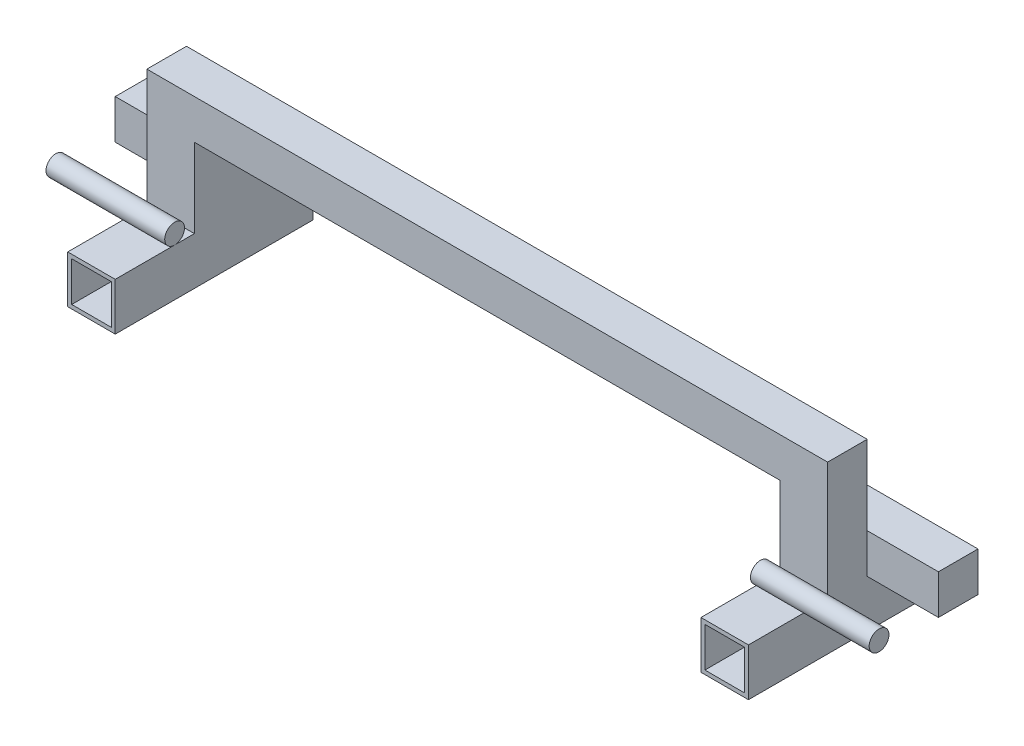
ISO-10303-21;
HEADER;
FILE_DESCRIPTION(('STEP AP214'),'2;1');
FILE_NAME('part.step','',(''),(''),'','','');
FILE_SCHEMA(('AUTOMOTIVE_DESIGN { 1 0 10303 214 1 1 1 1 }'));
ENDSEC;
DATA;
#1=APPLICATION_CONTEXT('core data for automotive mechanical design processes');
#2=APPLICATION_PROTOCOL_DEFINITION('international standard','automotive_design',2000,#1);
#3=PRODUCT_CONTEXT('',#1,'mechanical');
#4=PRODUCT('Part','Part','',(#3));
#5=PRODUCT_RELATED_PRODUCT_CATEGORY('part','',(#4));
#6=PRODUCT_DEFINITION_FORMATION('','',#4);
#7=PRODUCT_DEFINITION_CONTEXT('part definition',#1,'design');
#8=PRODUCT_DEFINITION('design','',#6,#7);
#9=PRODUCT_DEFINITION_SHAPE('','',#8);
#10=(LENGTH_UNIT() NAMED_UNIT(*) SI_UNIT(.MILLI.,.METRE.));
#11=(NAMED_UNIT(*) PLANE_ANGLE_UNIT() SI_UNIT($,.RADIAN.));
#12=(NAMED_UNIT(*) SI_UNIT($,.STERADIAN.) SOLID_ANGLE_UNIT());
#13=UNCERTAINTY_MEASURE_WITH_UNIT(LENGTH_MEASURE(1.E-05),#10,'distance_accuracy_value','');
#14=(GEOMETRIC_REPRESENTATION_CONTEXT(3) GLOBAL_UNCERTAINTY_ASSIGNED_CONTEXT((#13)) GLOBAL_UNIT_ASSIGNED_CONTEXT((#10,
#11,#12)) REPRESENTATION_CONTEXT('',''));
#15=CARTESIAN_POINT('',(0.,0.,0.));
#16=DIRECTION('',(0.,0.,1.));
#17=DIRECTION('',(1.,0.,0.));
#18=AXIS2_PLACEMENT_3D('',#15,#16,#17);
#19=CARTESIAN_POINT('',(75.2455323758821,26.8795883372539,35.));
#20=DIRECTION('',(-1.,0.,0.));
#21=DIRECTION('',(0.,0.,-1.));
#22=AXIS2_PLACEMENT_3D('',#19,#20,#21);
#23=CYLINDRICAL_SURFACE('',#22,2.5);
#24=CARTESIAN_POINT('',(75.2455323758821,26.8795883372539,35.));
#25=DIRECTION('',(1.,0.,0.));
#26=DIRECTION('',(0.,0.,-1.));
#27=AXIS2_PLACEMENT_3D('',#24,#25,#26);
#28=CIRCLE('',#27,2.5);
#29=CARTESIAN_POINT('',(75.2455323758821,26.8795883372539,32.5));
#30=VERTEX_POINT('',#29);
#31=EDGE_CURVE('E45',#30,#30,#28,.T.);
#32=ORIENTED_EDGE('',*,*,#31,.F.);
#33=EDGE_LOOP('',(#32));
#34=FACE_BOUND('',#33,.T.);
#35=CARTESIAN_POINT('',(45.2455323758821,26.8795883372539,35.));
#36=DIRECTION('',(1.,0.,0.));
#37=DIRECTION('',(0.,0.,-1.));
#38=AXIS2_PLACEMENT_3D('',#35,#36,#37);
#39=CIRCLE('',#38,2.5);
#40=CARTESIAN_POINT('',(45.2455323758821,26.8795883372539,32.5));
#41=VERTEX_POINT('',#40);
#42=EDGE_CURVE('E11',#41,#41,#39,.T.);
#43=ORIENTED_EDGE('',*,*,#42,.T.);
#44=EDGE_LOOP('',(#43));
#45=FACE_BOUND('',#44,.T.);
#46=ADVANCED_FACE('F41',(#34,#45),#23,.T.);
#47=CARTESIAN_POINT('',(75.2455323758821,26.8795883372539,35.));
#48=DIRECTION('',(-1.,0.,0.));
#49=DIRECTION('',(0.,0.,-1.));
#50=AXIS2_PLACEMENT_3D('',#47,#48,#49);
#51=PLANE('',#50);
#52=ORIENTED_EDGE('',*,*,#31,.T.);
#53=EDGE_LOOP('',(#52));
#54=FACE_BOUND('',#53,.T.);
#55=ADVANCED_FACE('F43',(#54),#51,.F.);
#56=CARTESIAN_POINT('',(45.2455323758821,26.8795883372539,35.));
#57=DIRECTION('',(-1.,0.,0.));
#58=DIRECTION('',(0.,0.,-1.));
#59=AXIS2_PLACEMENT_3D('',#56,#57,#58);
#60=PLANE('',#59);
#61=ORIENTED_EDGE('',*,*,#42,.F.);
#62=EDGE_LOOP('',(#61));
#63=FACE_BOUND('',#62,.T.);
#64=ADVANCED_FACE('F60',(#63),#60,.T.);
#65=CLOSED_SHELL('',(#46,#55,#64));
#66=MANIFOLD_SOLID_BREP('B2',#65);
#67=CARTESIAN_POINT('',(-132.754467624118,26.8795883372539,35.));
#68=DIRECTION('',(1.,0.,0.));
#69=DIRECTION('',(0.,0.,-1.));
#70=AXIS2_PLACEMENT_3D('',#67,#68,#69);
#71=CYLINDRICAL_SURFACE('',#70,2.5);
#72=CARTESIAN_POINT('',(-132.754467624118,26.8795883372539,35.));
#73=DIRECTION('',(1.,0.,0.));
#74=DIRECTION('',(0.,0.,-1.));
#75=AXIS2_PLACEMENT_3D('',#72,#73,#74);
#76=CIRCLE('',#75,2.5);
#77=CARTESIAN_POINT('',(-132.754467624118,26.8795883372539,32.5));
#78=VERTEX_POINT('',#77);
#79=EDGE_CURVE('E94',#78,#78,#76,.T.);
#80=ORIENTED_EDGE('',*,*,#79,.T.);
#81=EDGE_LOOP('',(#80));
#82=FACE_BOUND('',#81,.T.);
#83=CARTESIAN_POINT('',(-102.754467624118,26.8795883372539,35.));
#84=DIRECTION('',(1.,0.,0.));
#85=DIRECTION('',(0.,0.,-1.));
#86=AXIS2_PLACEMENT_3D('',#83,#84,#85);
#87=CIRCLE('',#86,2.5);
#88=CARTESIAN_POINT('',(-102.754467624118,26.8795883372539,32.5));
#89=VERTEX_POINT('',#88);
#90=EDGE_CURVE('E40',#89,#89,#87,.T.);
#91=ORIENTED_EDGE('',*,*,#90,.F.);
#92=EDGE_LOOP('',(#91));
#93=FACE_BOUND('',#92,.T.);
#94=ADVANCED_FACE('F90',(#82,#93),#71,.T.);
#95=CARTESIAN_POINT('',(-132.754467624118,26.8795883372539,35.));
#96=DIRECTION('',(1.,0.,0.));
#97=DIRECTION('',(0.,0.,-1.));
#98=AXIS2_PLACEMENT_3D('',#95,#96,#97);
#99=PLANE('',#98);
#100=ORIENTED_EDGE('',*,*,#79,.F.);
#101=EDGE_LOOP('',(#100));
#102=FACE_BOUND('',#101,.T.);
#103=ADVANCED_FACE('F92',(#102),#99,.F.);
#104=CARTESIAN_POINT('',(-102.754467624118,26.8795883372539,35.));
#105=DIRECTION('',(1.,0.,0.));
#106=DIRECTION('',(0.,0.,-1.));
#107=AXIS2_PLACEMENT_3D('',#104,#105,#106);
#108=PLANE('',#107);
#109=ORIENTED_EDGE('',*,*,#90,.T.);
#110=EDGE_LOOP('',(#109));
#111=FACE_BOUND('',#110,.T.);
#112=ADVANCED_FACE('F106',(#111),#108,.T.);
#113=CLOSED_SHELL('',(#94,#103,#112));
#114=MANIFOLD_SOLID_BREP('B6',#113);
#115=CARTESIAN_POINT('',(57.2455323758821,44.3795883372539,20.));
#116=DIRECTION('',(0.,-1.,0.));
#117=DIRECTION('',(0.,0.,-1.));
#118=AXIS2_PLACEMENT_3D('',#115,#116,#117);
#119=PLANE('',#118);
#120=DIRECTION('',(-1.,0.,0.));
#121=VECTOR('',#120,1.);
#122=CARTESIAN_POINT('',(57.2455323758821,44.3795883372539,20.));
#123=LINE('',#122,#121);
#124=CARTESIAN_POINT('',(45.2455323758821,44.3795883372539,20.));
#125=VERTEX_POINT('',#124);
#126=CARTESIAN_POINT('',(-102.754467624118,44.3795883372539,20.));
#127=VERTEX_POINT('',#126);
#128=EDGE_CURVE('E153',#125,#127,#123,.T.);
#129=ORIENTED_EDGE('',*,*,#128,.F.);
#130=DIRECTION('',(0.,0.,1.));
#131=VECTOR('',#130,1.);
#132=CARTESIAN_POINT('',(45.2455323758821,44.3795883372539,20.));
#133=LINE('',#132,#131);
#134=CARTESIAN_POINT('',(45.2455323758821,44.3795883372539,30.));
#135=VERTEX_POINT('',#134);
#136=EDGE_CURVE('E148',#125,#135,#133,.T.);
#137=ORIENTED_EDGE('',*,*,#136,.T.);
#138=DIRECTION('',(-1.,0.,0.));
#139=VECTOR('',#138,1.);
#140=CARTESIAN_POINT('',(57.2455323758821,44.3795883372539,30.));
#141=LINE('',#140,#139);
#142=CARTESIAN_POINT('',(-102.754467624118,44.3795883372539,30.));
#143=VERTEX_POINT('',#142);
#144=EDGE_CURVE('E134',#135,#143,#141,.T.);
#145=ORIENTED_EDGE('',*,*,#144,.T.);
#146=DIRECTION('',(0.,0.,1.));
#147=VECTOR('',#146,1.);
#148=CARTESIAN_POINT('',(-102.754467624118,44.3795883372539,20.));
#149=LINE('',#148,#147);
#150=EDGE_CURVE('E436',#127,#143,#149,.T.);
#151=ORIENTED_EDGE('',*,*,#150,.F.);
#152=EDGE_LOOP('',(#129,#137,#145,#151));
#153=FACE_BOUND('',#152,.T.);
#154=ADVANCED_FACE('F130',(#153),#119,.T.);
#155=CARTESIAN_POINT('',(-114.754467624118,24.3795883372539,50.));
#156=DIRECTION('',(0.,-1.,0.));
#157=DIRECTION('',(0.,0.,-1.));
#158=AXIS2_PLACEMENT_3D('',#155,#156,#157);
#159=PLANE('',#158);
#160=DIRECTION('',(1.,0.,0.));
#161=VECTOR('',#160,1.);
#162=CARTESIAN_POINT('',(-114.754467624118,24.3795883372539,30.));
#163=LINE('',#162,#161);
#164=CARTESIAN_POINT('',(-114.754467624118,24.3795883372539,30.));
#165=VERTEX_POINT('',#164);
#166=CARTESIAN_POINT('',(-102.754467624118,24.3795883372539,30.));
#167=VERTEX_POINT('',#166);
#168=EDGE_CURVE('E441',#165,#167,#163,.T.);
#169=ORIENTED_EDGE('',*,*,#168,.F.);
#170=DIRECTION('',(0.,0.,-1.));
#171=VECTOR('',#170,1.);
#172=CARTESIAN_POINT('',(-114.754467624118,24.3795883372539,50.));
#173=LINE('',#172,#171);
#174=CARTESIAN_POINT('',(-114.754467624118,24.3795883372539,50.));
#175=VERTEX_POINT('',#174);
#176=EDGE_CURVE('E509',#175,#165,#173,.T.);
#177=ORIENTED_EDGE('',*,*,#176,.F.);
#178=DIRECTION('',(-1.,0.,0.));
#179=VECTOR('',#178,1.);
#180=CARTESIAN_POINT('',(-114.754467624118,24.3795883372539,50.));
#181=LINE('',#180,#179);
#182=CARTESIAN_POINT('',(-102.754467624118,24.3795883372539,50.));
#183=VERTEX_POINT('',#182);
#184=EDGE_CURVE('E505',#183,#175,#181,.T.);
#185=ORIENTED_EDGE('',*,*,#184,.F.);
#186=DIRECTION('',(0.,0.,-1.));
#187=VECTOR('',#186,1.);
#188=CARTESIAN_POINT('',(-102.754467624118,24.3795883372539,50.));
#189=LINE('',#188,#187);
#190=EDGE_CURVE('E497',#183,#167,#189,.T.);
#191=ORIENTED_EDGE('',*,*,#190,.T.);
#192=EDGE_LOOP('',(#169,#177,#185,#191));
#193=FACE_BOUND('',#192,.T.);
#194=ADVANCED_FACE('F504',(#193),#159,.F.);
#195=CARTESIAN_POINT('',(-132.754467624118,0.,20.));
#196=DIRECTION('',(0.,0.,-1.));
#197=DIRECTION('',(-1.,0.,0.));
#198=AXIS2_PLACEMENT_3D('',#195,#196,#197);
#199=PLANE('',#198);
#200=DIRECTION('',(0.,-1.,0.));
#201=VECTOR('',#200,1.);
#202=CARTESIAN_POINT('',(-114.754467624118,44.3795883372539,20.));
#203=LINE('',#202,#201);
#204=CARTESIAN_POINT('',(-114.754467624118,34.3795883372539,20.));
#205=VERTEX_POINT('',#204);
#206=CARTESIAN_POINT('',(-114.754467624118,24.3795883372539,20.));
#207=VERTEX_POINT('',#206);
#208=EDGE_CURVE('E440',#205,#207,#203,.T.);
#209=ORIENTED_EDGE('',*,*,#208,.F.);
#210=DIRECTION('',(1.,0.,0.));
#211=VECTOR('',#210,1.);
#212=CARTESIAN_POINT('',(-132.754467624118,34.3795883372539,20.));
#213=LINE('',#212,#211);
#214=CARTESIAN_POINT('',(-132.754467624118,34.3795883372539,20.));
#215=VERTEX_POINT('',#214);
#216=EDGE_CURVE('E472',#215,#205,#213,.T.);
#217=ORIENTED_EDGE('',*,*,#216,.F.);
#218=DIRECTION('',(0.,1.,0.));
#219=VECTOR('',#218,1.);
#220=CARTESIAN_POINT('',(-132.754467624118,0.,20.));
#221=LINE('',#220,#219);
#222=CARTESIAN_POINT('',(-132.754467624118,24.3795883372539,20.));
#223=VERTEX_POINT('',#222);
#224=EDGE_CURVE('E463',#223,#215,#221,.T.);
#225=ORIENTED_EDGE('',*,*,#224,.F.);
#226=DIRECTION('',(1.,0.,0.));
#227=VECTOR('',#226,1.);
#228=CARTESIAN_POINT('',(-132.754467624118,24.3795883372539,20.));
#229=LINE('',#228,#227);
#230=EDGE_CURVE('E468',#223,#207,#229,.T.);
#231=ORIENTED_EDGE('',*,*,#230,.T.);
#232=EDGE_LOOP('',(#209,#217,#225,#231));
#233=FACE_BOUND('',#232,.T.);
#234=ADVANCED_FACE('F599',(#233),#199,.F.);
#235=CARTESIAN_POINT('',(0.,0.,50.));
#236=DIRECTION('',(0.,0.,-1.));
#237=DIRECTION('',(-1.,0.,0.));
#238=AXIS2_PLACEMENT_3D('',#235,#236,#237);
#239=PLANE('',#238);
#240=DIRECTION('',(0.,-1.,0.));
#241=VECTOR('',#240,1.);
#242=CARTESIAN_POINT('',(-114.754467624118,12.3795883372539,50.));
#243=LINE('',#242,#241);
#244=CARTESIAN_POINT('',(-114.754467624118,12.3795883372539,50.));
#245=VERTEX_POINT('',#244);
#246=EDGE_CURVE('E520',#175,#245,#243,.T.);
#247=ORIENTED_EDGE('',*,*,#246,.T.);
#248=DIRECTION('',(1.,0.,0.));
#249=VECTOR('',#248,1.);
#250=CARTESIAN_POINT('',(-114.754467624118,12.3795883372539,50.));
#251=LINE('',#250,#249);
#252=CARTESIAN_POINT('',(-102.754467624118,12.3795883372539,50.));
#253=VERTEX_POINT('',#252);
#254=EDGE_CURVE('E533',#245,#253,#251,.T.);
#255=ORIENTED_EDGE('',*,*,#254,.T.);
#256=DIRECTION('',(0.,1.,0.));
#257=VECTOR('',#256,1.);
#258=CARTESIAN_POINT('',(-102.754467624118,12.3795883372539,50.));
#259=LINE('',#258,#257);
#260=EDGE_CURVE('E531',#253,#183,#259,.T.);
#261=ORIENTED_EDGE('',*,*,#260,.T.);
#262=ORIENTED_EDGE('',*,*,#184,.T.);
#263=EDGE_LOOP('',(#247,#255,#261,#262));
#264=FACE_BOUND('',#263,.T.);
#265=DIRECTION('',(0.,-1.,0.));
#266=VECTOR('',#265,1.);
#267=CARTESIAN_POINT('',(-113.754467624118,13.3795883372539,50.));
#268=LINE('',#267,#266);
#269=CARTESIAN_POINT('',(-113.754467624118,23.3795883372539,50.));
#270=VERTEX_POINT('',#269);
#271=CARTESIAN_POINT('',(-113.754467624118,13.3795883372539,50.));
#272=VERTEX_POINT('',#271);
#273=EDGE_CURVE('E481',#270,#272,#268,.T.);
#274=ORIENTED_EDGE('',*,*,#273,.F.);
#275=DIRECTION('',(-1.,0.,0.));
#276=VECTOR('',#275,1.);
#277=CARTESIAN_POINT('',(-113.754467624118,23.3795883372539,50.));
#278=LINE('',#277,#276);
#279=CARTESIAN_POINT('',(-103.754467624118,23.3795883372539,50.));
#280=VERTEX_POINT('',#279);
#281=EDGE_CURVE('E546',#280,#270,#278,.T.);
#282=ORIENTED_EDGE('',*,*,#281,.F.);
#283=DIRECTION('',(0.,1.,0.));
#284=VECTOR('',#283,1.);
#285=CARTESIAN_POINT('',(-103.754467624118,13.3795883372539,50.));
#286=LINE('',#285,#284);
#287=CARTESIAN_POINT('',(-103.754467624118,13.3795883372539,50.));
#288=VERTEX_POINT('',#287);
#289=EDGE_CURVE('E559',#288,#280,#286,.T.);
#290=ORIENTED_EDGE('',*,*,#289,.F.);
#291=DIRECTION('',(1.,0.,0.));
#292=VECTOR('',#291,1.);
#293=CARTESIAN_POINT('',(-113.754467624118,13.3795883372539,50.));
#294=LINE('',#293,#292);
#295=EDGE_CURVE('E561',#272,#288,#294,.T.);
#296=ORIENTED_EDGE('',*,*,#295,.F.);
#297=EDGE_LOOP('',(#274,#282,#290,#296));
#298=FACE_BOUND('',#297,.T.);
#299=ADVANCED_FACE('F574',(#264,#298),#239,.F.);
#300=CARTESIAN_POINT('',(0.,0.,0.));
#301=DIRECTION('',(0.,0.,-1.));
#302=DIRECTION('',(-1.,0.,0.));
#303=AXIS2_PLACEMENT_3D('',#300,#301,#302);
#304=PLANE('',#303);
#305=DIRECTION('',(0.,-1.,0.));
#306=VECTOR('',#305,1.);
#307=CARTESIAN_POINT('',(-114.754467624118,12.3795883372539,0.));
#308=LINE('',#307,#306);
#309=CARTESIAN_POINT('',(-114.754467624118,24.3795883372539,0.));
#310=VERTEX_POINT('',#309);
#311=CARTESIAN_POINT('',(-114.754467624118,12.3795883372539,0.));
#312=VERTEX_POINT('',#311);
#313=EDGE_CURVE('E526',#310,#312,#308,.T.);
#314=ORIENTED_EDGE('',*,*,#313,.F.);
#315=DIRECTION('',(-1.,0.,0.));
#316=VECTOR('',#315,1.);
#317=CARTESIAN_POINT('',(-114.754467624118,24.3795883372539,0.));
#318=LINE('',#317,#316);
#319=CARTESIAN_POINT('',(-102.754467624118,24.3795883372539,0.));
#320=VERTEX_POINT('',#319);
#321=EDGE_CURVE('E517',#320,#310,#318,.T.);
#322=ORIENTED_EDGE('',*,*,#321,.F.);
#323=DIRECTION('',(0.,1.,0.));
#324=VECTOR('',#323,1.);
#325=CARTESIAN_POINT('',(-102.754467624118,12.3795883372539,0.));
#326=LINE('',#325,#324);
#327=CARTESIAN_POINT('',(-102.754467624118,12.3795883372539,0.));
#328=VERTEX_POINT('',#327);
#329=EDGE_CURVE('E521',#328,#320,#326,.T.);
#330=ORIENTED_EDGE('',*,*,#329,.F.);
#331=DIRECTION('',(1.,0.,0.));
#332=VECTOR('',#331,1.);
#333=CARTESIAN_POINT('',(-114.754467624118,12.3795883372539,0.));
#334=LINE('',#333,#332);
#335=EDGE_CURVE('E524',#312,#328,#334,.T.);
#336=ORIENTED_EDGE('',*,*,#335,.F.);
#337=EDGE_LOOP('',(#314,#322,#330,#336));
#338=FACE_BOUND('',#337,.T.);
#339=DIRECTION('',(-1.,0.,0.));
#340=VECTOR('',#339,1.);
#341=CARTESIAN_POINT('',(-113.754467624118,23.3795883372539,0.));
#342=LINE('',#341,#340);
#343=CARTESIAN_POINT('',(-103.754467624118,23.3795883372539,0.));
#344=VERTEX_POINT('',#343);
#345=CARTESIAN_POINT('',(-113.754467624118,23.3795883372539,0.));
#346=VERTEX_POINT('',#345);
#347=EDGE_CURVE('E547',#344,#346,#342,.T.);
#348=ORIENTED_EDGE('',*,*,#347,.T.);
#349=DIRECTION('',(0.,-1.,0.));
#350=VECTOR('',#349,1.);
#351=CARTESIAN_POINT('',(-113.754467624118,13.3795883372539,0.));
#352=LINE('',#351,#350);
#353=CARTESIAN_POINT('',(-113.754467624118,13.3795883372539,0.));
#354=VERTEX_POINT('',#353);
#355=EDGE_CURVE('E471',#346,#354,#352,.T.);
#356=ORIENTED_EDGE('',*,*,#355,.T.);
#357=DIRECTION('',(1.,0.,0.));
#358=VECTOR('',#357,1.);
#359=CARTESIAN_POINT('',(-113.754467624118,13.3795883372539,0.));
#360=LINE('',#359,#358);
#361=CARTESIAN_POINT('',(-103.754467624118,13.3795883372539,0.));
#362=VERTEX_POINT('',#361);
#363=EDGE_CURVE('E553',#354,#362,#360,.T.);
#364=ORIENTED_EDGE('',*,*,#363,.T.);
#365=DIRECTION('',(0.,1.,0.));
#366=VECTOR('',#365,1.);
#367=CARTESIAN_POINT('',(-103.754467624118,13.3795883372539,0.));
#368=LINE('',#367,#366);
#369=EDGE_CURVE('E550',#362,#344,#368,.T.);
#370=ORIENTED_EDGE('',*,*,#369,.T.);
#371=EDGE_LOOP('',(#348,#356,#364,#370));
#372=FACE_BOUND('',#371,.T.);
#373=ADVANCED_FACE('F580',(#338,#372),#304,.T.);
#374=CARTESIAN_POINT('',(-114.754467624118,12.3795883372539,50.));
#375=DIRECTION('',(1.,0.,0.));
#376=DIRECTION('',(0.,0.,-1.));
#377=AXIS2_PLACEMENT_3D('',#374,#375,#376);
#378=PLANE('',#377);
#379=ORIENTED_EDGE('',*,*,#313,.T.);
#380=DIRECTION('',(0.,0.,-1.));
#381=VECTOR('',#380,1.);
#382=CARTESIAN_POINT('',(-114.754467624118,12.3795883372539,50.));
#383=LINE('',#382,#381);
#384=EDGE_CURVE('E140',#245,#312,#383,.T.);
#385=ORIENTED_EDGE('',*,*,#384,.F.);
#386=ORIENTED_EDGE('',*,*,#246,.F.);
#387=ORIENTED_EDGE('',*,*,#176,.T.);
#388=DIRECTION('',(0.,-1.,0.));
#389=VECTOR('',#388,1.);
#390=CARTESIAN_POINT('',(-114.754467624118,44.3795883372539,30.));
#391=LINE('',#390,#389);
#392=CARTESIAN_POINT('',(-114.754467624118,54.3795883372539,30.));
#393=VERTEX_POINT('',#392);
#394=EDGE_CURVE('E451',#393,#165,#391,.T.);
#395=ORIENTED_EDGE('',*,*,#394,.F.);
#396=DIRECTION('',(0.,0.,1.));
#397=VECTOR('',#396,1.);
#398=CARTESIAN_POINT('',(-114.754467624118,54.3795883372539,20.));
#399=LINE('',#398,#397);
#400=CARTESIAN_POINT('',(-114.754467624118,54.3795883372539,20.));
#401=VERTEX_POINT('',#400);
#402=EDGE_CURVE('E413',#401,#393,#399,.T.);
#403=ORIENTED_EDGE('',*,*,#402,.F.);
#404=EDGE_CURVE('E435',#401,#205,#203,.T.);
#405=ORIENTED_EDGE('',*,*,#404,.T.);
#406=ORIENTED_EDGE('',*,*,#208,.T.);
#407=CARTESIAN_POINT('',(-114.754467624118,24.3795883372539,10.));
#408=VERTEX_POINT('',#407);
#409=EDGE_CURVE('E515',#207,#408,#173,.T.);
#410=ORIENTED_EDGE('',*,*,#409,.T.);
#411=EDGE_CURVE('E516',#408,#310,#173,.T.);
#412=ORIENTED_EDGE('',*,*,#411,.T.);
#413=EDGE_LOOP('',(#379,#385,#386,#387,#395,#403,#405,#406,#410,#412));
#414=FACE_BOUND('',#413,.T.);
#415=ADVANCED_FACE('F132',(#414),#378,.F.);
#416=CARTESIAN_POINT('',(-114.754467624118,12.3795883372539,50.));
#417=DIRECTION('',(0.,1.,0.));
#418=DIRECTION('',(0.,0.,1.));
#419=AXIS2_PLACEMENT_3D('',#416,#417,#418);
#420=PLANE('',#419);
#421=ORIENTED_EDGE('',*,*,#335,.T.);
#422=DIRECTION('',(0.,0.,-1.));
#423=VECTOR('',#422,1.);
#424=CARTESIAN_POINT('',(-102.754467624118,12.3795883372539,50.));
#425=LINE('',#424,#423);
#426=EDGE_CURVE('E506',#253,#328,#425,.T.);
#427=ORIENTED_EDGE('',*,*,#426,.F.);
#428=ORIENTED_EDGE('',*,*,#254,.F.);
#429=ORIENTED_EDGE('',*,*,#384,.T.);
#430=EDGE_LOOP('',(#421,#427,#428,#429));
#431=FACE_BOUND('',#430,.T.);
#432=ADVANCED_FACE('F660',(#431),#420,.F.);
#433=CARTESIAN_POINT('',(-102.754467624118,12.3795883372539,50.));
#434=DIRECTION('',(-1.,0.,0.));
#435=DIRECTION('',(0.,0.,1.));
#436=AXIS2_PLACEMENT_3D('',#433,#434,#435);
#437=PLANE('',#436);
#438=DIRECTION('',(0.,-1.,0.));
#439=VECTOR('',#438,1.);
#440=CARTESIAN_POINT('',(-102.754467624118,44.3795883372539,30.));
#441=LINE('',#440,#439);
#442=EDGE_CURVE('E434',#143,#167,#441,.T.);
#443=ORIENTED_EDGE('',*,*,#442,.T.);
#444=ORIENTED_EDGE('',*,*,#190,.F.);
#445=ORIENTED_EDGE('',*,*,#260,.F.);
#446=ORIENTED_EDGE('',*,*,#426,.T.);
#447=ORIENTED_EDGE('',*,*,#329,.T.);
#448=CARTESIAN_POINT('',(-102.754467624118,24.3795883372539,10.));
#449=VERTEX_POINT('',#448);
#450=EDGE_CURVE('E485',#449,#320,#189,.T.);
#451=ORIENTED_EDGE('',*,*,#450,.F.);
#452=DIRECTION('',(0.,1.,0.));
#453=VECTOR('',#452,1.);
#454=CARTESIAN_POINT('',(-102.754467624118,0.,10.));
#455=LINE('',#454,#453);
#456=CARTESIAN_POINT('',(-102.754467624118,34.3795883372539,10.));
#457=VERTEX_POINT('',#456);
#458=EDGE_CURVE('E453',#449,#457,#455,.T.);
#459=ORIENTED_EDGE('',*,*,#458,.T.);
#460=DIRECTION('',(0.,0.,-1.));
#461=VECTOR('',#460,1.);
#462=CARTESIAN_POINT('',(-102.754467624118,34.3795883372539,0.));
#463=LINE('',#462,#461);
#464=CARTESIAN_POINT('',(-102.754467624118,34.3795883372539,20.));
#465=VERTEX_POINT('',#464);
#466=EDGE_CURVE('E458',#465,#457,#463,.T.);
#467=ORIENTED_EDGE('',*,*,#466,.F.);
#468=DIRECTION('',(0.,-1.,0.));
#469=VECTOR('',#468,1.);
#470=CARTESIAN_POINT('',(-102.754467624118,44.3795883372539,20.));
#471=LINE('',#470,#469);
#472=EDGE_CURVE('E432',#127,#465,#471,.T.);
#473=ORIENTED_EDGE('',*,*,#472,.F.);
#474=ORIENTED_EDGE('',*,*,#150,.T.);
#475=EDGE_LOOP('',(#443,#444,#445,#446,#447,#451,#459,#467,#473,#474));
#476=FACE_BOUND('',#475,.T.);
#477=ADVANCED_FACE('F494',(#476),#437,.F.);
#478=ORIENTED_EDGE('',*,*,#411,.F.);
#479=DIRECTION('',(1.,0.,0.));
#480=VECTOR('',#479,1.);
#481=CARTESIAN_POINT('',(-132.754467624118,24.3795883372539,10.));
#482=LINE('',#481,#480);
#483=EDGE_CURVE('E88',#408,#449,#482,.T.);
#484=ORIENTED_EDGE('',*,*,#483,.T.);
#485=ORIENTED_EDGE('',*,*,#450,.T.);
#486=ORIENTED_EDGE('',*,*,#321,.T.);
#487=EDGE_LOOP('',(#478,#484,#485,#486));
#488=FACE_BOUND('',#487,.T.);
#489=ADVANCED_FACE('F601',(#488),#159,.F.);
#490=CARTESIAN_POINT('',(-113.754467624118,13.3795883372539,50.));
#491=DIRECTION('',(1.,0.,0.));
#492=DIRECTION('',(0.,0.,-1.));
#493=AXIS2_PLACEMENT_3D('',#490,#491,#492);
#494=PLANE('',#493);
#495=ORIENTED_EDGE('',*,*,#355,.F.);
#496=DIRECTION('',(0.,0.,-1.));
#497=VECTOR('',#496,1.);
#498=CARTESIAN_POINT('',(-113.754467624118,23.3795883372539,50.));
#499=LINE('',#498,#497);
#500=EDGE_CURVE('E543',#270,#346,#499,.T.);
#501=ORIENTED_EDGE('',*,*,#500,.F.);
#502=ORIENTED_EDGE('',*,*,#273,.T.);
#503=DIRECTION('',(0.,0.,-1.));
#504=VECTOR('',#503,1.);
#505=CARTESIAN_POINT('',(-113.754467624118,13.3795883372539,50.));
#506=LINE('',#505,#504);
#507=EDGE_CURVE('E529',#272,#354,#506,.T.);
#508=ORIENTED_EDGE('',*,*,#507,.T.);
#509=EDGE_LOOP('',(#495,#501,#502,#508));
#510=FACE_BOUND('',#509,.T.);
#511=ADVANCED_FACE('F569',(#510),#494,.T.);
#512=CARTESIAN_POINT('',(-113.754467624118,13.3795883372539,50.));
#513=DIRECTION('',(0.,1.,0.));
#514=DIRECTION('',(0.,0.,1.));
#515=AXIS2_PLACEMENT_3D('',#512,#513,#514);
#516=PLANE('',#515);
#517=ORIENTED_EDGE('',*,*,#363,.F.);
#518=ORIENTED_EDGE('',*,*,#507,.F.);
#519=ORIENTED_EDGE('',*,*,#295,.T.);
#520=DIRECTION('',(0.,0.,-1.));
#521=VECTOR('',#520,1.);
#522=CARTESIAN_POINT('',(-103.754467624118,13.3795883372539,50.));
#523=LINE('',#522,#521);
#524=EDGE_CURVE('E539',#288,#362,#523,.T.);
#525=ORIENTED_EDGE('',*,*,#524,.T.);
#526=EDGE_LOOP('',(#517,#518,#519,#525));
#527=FACE_BOUND('',#526,.T.);
#528=ADVANCED_FACE('F572',(#527),#516,.T.);
#529=CARTESIAN_POINT('',(-103.754467624118,13.3795883372539,50.));
#530=DIRECTION('',(-1.,0.,0.));
#531=DIRECTION('',(0.,0.,1.));
#532=AXIS2_PLACEMENT_3D('',#529,#530,#531);
#533=PLANE('',#532);
#534=ORIENTED_EDGE('',*,*,#369,.F.);
#535=ORIENTED_EDGE('',*,*,#524,.F.);
#536=ORIENTED_EDGE('',*,*,#289,.T.);
#537=DIRECTION('',(0.,0.,-1.));
#538=VECTOR('',#537,1.);
#539=CARTESIAN_POINT('',(-103.754467624118,23.3795883372539,50.));
#540=LINE('',#539,#538);
#541=EDGE_CURVE('E541',#280,#344,#540,.T.);
#542=ORIENTED_EDGE('',*,*,#541,.T.);
#543=EDGE_LOOP('',(#534,#535,#536,#542));
#544=FACE_BOUND('',#543,.T.);
#545=ADVANCED_FACE('F577',(#544),#533,.T.);
#546=CARTESIAN_POINT('',(-113.754467624118,23.3795883372539,50.));
#547=DIRECTION('',(0.,-1.,0.));
#548=DIRECTION('',(0.,0.,-1.));
#549=AXIS2_PLACEMENT_3D('',#546,#547,#548);
#550=PLANE('',#549);
#551=ORIENTED_EDGE('',*,*,#347,.F.);
#552=ORIENTED_EDGE('',*,*,#541,.F.);
#553=ORIENTED_EDGE('',*,*,#281,.T.);
#554=ORIENTED_EDGE('',*,*,#500,.T.);
#555=EDGE_LOOP('',(#551,#552,#553,#554));
#556=FACE_BOUND('',#555,.T.);
#557=ADVANCED_FACE('F582',(#556),#550,.T.);
#558=CARTESIAN_POINT('',(-132.754467624118,24.3795883372539,0.));
#559=DIRECTION('',(0.,1.,0.));
#560=DIRECTION('',(0.,0.,1.));
#561=AXIS2_PLACEMENT_3D('',#558,#559,#560);
#562=PLANE('',#561);
#563=ORIENTED_EDGE('',*,*,#409,.F.);
#564=ORIENTED_EDGE('',*,*,#230,.F.);
#565=DIRECTION('',(0.,0.,1.));
#566=VECTOR('',#565,1.);
#567=CARTESIAN_POINT('',(-132.754467624118,24.3795883372539,0.));
#568=LINE('',#567,#566);
#569=CARTESIAN_POINT('',(-132.754467624118,24.3795883372539,10.));
#570=VERTEX_POINT('',#569);
#571=EDGE_CURVE('E454',#570,#223,#568,.T.);
#572=ORIENTED_EDGE('',*,*,#571,.F.);
#573=EDGE_CURVE('E465',#570,#408,#482,.T.);
#574=ORIENTED_EDGE('',*,*,#573,.T.);
#575=EDGE_LOOP('',(#563,#564,#572,#574));
#576=FACE_BOUND('',#575,.T.);
#577=ADVANCED_FACE('F584',(#576),#562,.F.);
#578=CARTESIAN_POINT('',(-132.754467624118,34.3795883372539,0.));
#579=DIRECTION('',(0.,-1.,0.));
#580=DIRECTION('',(0.,0.,-1.));
#581=AXIS2_PLACEMENT_3D('',#578,#579,#580);
#582=PLANE('',#581);
#583=ORIENTED_EDGE('',*,*,#466,.T.);
#584=DIRECTION('',(1.,0.,0.));
#585=VECTOR('',#584,1.);
#586=CARTESIAN_POINT('',(-132.754467624118,34.3795883372539,10.));
#587=LINE('',#586,#585);
#588=CARTESIAN_POINT('',(-132.754467624118,34.3795883372539,10.));
#589=VERTEX_POINT('',#588);
#590=EDGE_CURVE('E476',#589,#457,#587,.T.);
#591=ORIENTED_EDGE('',*,*,#590,.F.);
#592=DIRECTION('',(0.,0.,-1.));
#593=VECTOR('',#592,1.);
#594=CARTESIAN_POINT('',(-132.754467624118,34.3795883372539,0.));
#595=LINE('',#594,#593);
#596=EDGE_CURVE('E461',#215,#589,#595,.T.);
#597=ORIENTED_EDGE('',*,*,#596,.F.);
#598=ORIENTED_EDGE('',*,*,#216,.T.);
#599=EDGE_CURVE('E475',#205,#465,#213,.T.);
#600=ORIENTED_EDGE('',*,*,#599,.T.);
#601=EDGE_LOOP('',(#583,#591,#597,#598,#600));
#602=FACE_BOUND('',#601,.T.);
#603=ADVANCED_FACE('F590',(#602),#582,.F.);
#604=CARTESIAN_POINT('',(-132.754467624118,0.,10.));
#605=DIRECTION('',(0.,0.,-1.));
#606=DIRECTION('',(-1.,0.,0.));
#607=AXIS2_PLACEMENT_3D('',#604,#605,#606);
#608=PLANE('',#607);
#609=ORIENTED_EDGE('',*,*,#458,.F.);
#610=ORIENTED_EDGE('',*,*,#483,.F.);
#611=ORIENTED_EDGE('',*,*,#573,.F.);
#612=DIRECTION('',(0.,1.,0.));
#613=VECTOR('',#612,1.);
#614=CARTESIAN_POINT('',(-132.754467624118,0.,10.));
#615=LINE('',#614,#613);
#616=EDGE_CURVE('E457',#570,#589,#615,.T.);
#617=ORIENTED_EDGE('',*,*,#616,.T.);
#618=ORIENTED_EDGE('',*,*,#590,.T.);
#619=EDGE_LOOP('',(#609,#610,#611,#617,#618));
#620=FACE_BOUND('',#619,.T.);
#621=ADVANCED_FACE('F618',(#620),#608,.T.);
#622=CARTESIAN_POINT('',(-132.754467624118,0.,0.));
#623=DIRECTION('',(1.,0.,0.));
#624=DIRECTION('',(0.,0.,-1.));
#625=AXIS2_PLACEMENT_3D('',#622,#623,#624);
#626=PLANE('',#625);
#627=ORIENTED_EDGE('',*,*,#571,.T.);
#628=ORIENTED_EDGE('',*,*,#224,.T.);
#629=ORIENTED_EDGE('',*,*,#596,.T.);
#630=ORIENTED_EDGE('',*,*,#616,.F.);
#631=EDGE_LOOP('',(#627,#628,#629,#630));
#632=FACE_BOUND('',#631,.T.);
#633=ADVANCED_FACE('F612',(#632),#626,.F.);
#634=CARTESIAN_POINT('',(-114.754467624118,44.3795883372539,20.));
#635=DIRECTION('',(0.,0.,-1.));
#636=DIRECTION('',(-1.,0.,0.));
#637=AXIS2_PLACEMENT_3D('',#634,#635,#636);
#638=PLANE('',#637);
#639=ORIENTED_EDGE('',*,*,#599,.F.);
#640=ORIENTED_EDGE('',*,*,#404,.F.);
#641=DIRECTION('',(-1.,0.,0.));
#642=VECTOR('',#641,1.);
#643=CARTESIAN_POINT('',(57.2455323758821,54.3795883372539,20.));
#644=LINE('',#643,#642);
#645=CARTESIAN_POINT('',(57.2455323758821,54.3795883372539,20.));
#646=VERTEX_POINT('',#645);
#647=EDGE_CURVE('E447',#646,#401,#644,.T.);
#648=ORIENTED_EDGE('',*,*,#647,.F.);
#649=DIRECTION('',(0.,1.,0.));
#650=VECTOR('',#649,1.);
#651=CARTESIAN_POINT('',(57.2455323758821,44.3795883372539,20.));
#652=LINE('',#651,#650);
#653=CARTESIAN_POINT('',(57.2455323758821,34.3795883372539,20.));
#654=VERTEX_POINT('',#653);
#655=EDGE_CURVE('E421',#654,#646,#652,.T.);
#656=ORIENTED_EDGE('',*,*,#655,.F.);
#657=DIRECTION('',(-1.,0.,0.));
#658=VECTOR('',#657,1.);
#659=CARTESIAN_POINT('',(75.2455323758821,34.3795883372539,20.));
#660=LINE('',#659,#658);
#661=CARTESIAN_POINT('',(45.2455323758821,34.3795883372539,20.));
#662=VERTEX_POINT('',#661);
#663=EDGE_CURVE('E402',#654,#662,#660,.T.);
#664=ORIENTED_EDGE('',*,*,#663,.T.);
#665=DIRECTION('',(0.,-1.,0.));
#666=VECTOR('',#665,1.);
#667=CARTESIAN_POINT('',(45.2455323758821,44.3795883372539,20.));
#668=LINE('',#667,#666);
#669=EDGE_CURVE('E376',#125,#662,#668,.T.);
#670=ORIENTED_EDGE('',*,*,#669,.F.);
#671=ORIENTED_EDGE('',*,*,#128,.T.);
#672=ORIENTED_EDGE('',*,*,#472,.T.);
#673=EDGE_LOOP('',(#639,#640,#648,#656,#664,#670,#671,#672));
#674=FACE_BOUND('',#673,.T.);
#675=ADVANCED_FACE('F609',(#674),#638,.T.);
#676=CARTESIAN_POINT('',(-114.754467624118,44.3795883372539,30.));
#677=DIRECTION('',(0.,0.,-1.));
#678=DIRECTION('',(-1.,0.,0.));
#679=AXIS2_PLACEMENT_3D('',#676,#677,#678);
#680=PLANE('',#679);
#681=ORIENTED_EDGE('',*,*,#168,.T.);
#682=ORIENTED_EDGE('',*,*,#442,.F.);
#683=ORIENTED_EDGE('',*,*,#144,.F.);
#684=DIRECTION('',(0.,-1.,0.));
#685=VECTOR('',#684,1.);
#686=CARTESIAN_POINT('',(45.2455323758821,44.3795883372539,30.));
#687=LINE('',#686,#685);
#688=CARTESIAN_POINT('',(45.2455323758821,24.3795883372539,30.));
#689=VERTEX_POINT('',#688);
#690=EDGE_CURVE('E368',#135,#689,#687,.T.);
#691=ORIENTED_EDGE('',*,*,#690,.T.);
#692=DIRECTION('',(-1.,0.,0.));
#693=VECTOR('',#692,1.);
#694=CARTESIAN_POINT('',(57.2455323758821,24.3795883372539,30.));
#695=LINE('',#694,#693);
#696=CARTESIAN_POINT('',(57.2455323758821,24.3795883372539,30.));
#697=VERTEX_POINT('',#696);
#698=EDGE_CURVE('E358',#697,#689,#695,.T.);
#699=ORIENTED_EDGE('',*,*,#698,.F.);
#700=DIRECTION('',(0.,1.,0.));
#701=VECTOR('',#700,1.);
#702=CARTESIAN_POINT('',(57.2455323758821,44.3795883372539,30.));
#703=LINE('',#702,#701);
#704=CARTESIAN_POINT('',(57.2455323758821,54.3795883372539,30.));
#705=VERTEX_POINT('',#704);
#706=EDGE_CURVE('E341',#697,#705,#703,.T.);
#707=ORIENTED_EDGE('',*,*,#706,.T.);
#708=DIRECTION('',(-1.,0.,0.));
#709=VECTOR('',#708,1.);
#710=CARTESIAN_POINT('',(57.2455323758821,54.3795883372539,30.));
#711=LINE('',#710,#709);
#712=EDGE_CURVE('E653',#705,#393,#711,.T.);
#713=ORIENTED_EDGE('',*,*,#712,.T.);
#714=ORIENTED_EDGE('',*,*,#394,.T.);
#715=EDGE_LOOP('',(#681,#682,#683,#691,#699,#707,#713,#714));
#716=FACE_BOUND('',#715,.T.);
#717=ADVANCED_FACE('F366',(#716),#680,.F.);
#718=CARTESIAN_POINT('',(57.2455323758821,54.3795883372539,20.));
#719=DIRECTION('',(0.,-1.,0.));
#720=DIRECTION('',(0.,0.,-1.));
#721=AXIS2_PLACEMENT_3D('',#718,#719,#720);
#722=PLANE('',#721);
#723=ORIENTED_EDGE('',*,*,#402,.T.);
#724=ORIENTED_EDGE('',*,*,#712,.F.);
#725=DIRECTION('',(0.,0.,1.));
#726=VECTOR('',#725,1.);
#727=CARTESIAN_POINT('',(57.2455323758821,54.3795883372539,20.));
#728=LINE('',#727,#726);
#729=EDGE_CURVE('E348',#646,#705,#728,.T.);
#730=ORIENTED_EDGE('',*,*,#729,.F.);
#731=ORIENTED_EDGE('',*,*,#647,.T.);
#732=EDGE_LOOP('',(#723,#724,#730,#731));
#733=FACE_BOUND('',#732,.T.);
#734=ADVANCED_FACE('F605',(#733),#722,.F.);
#735=CARTESIAN_POINT('',(57.2455323758821,0.,0.));
#736=DIRECTION('',(1.,0.,0.));
#737=DIRECTION('',(0.,0.,-1.));
#738=AXIS2_PLACEMENT_3D('',#735,#736,#737);
#739=PLANE('',#738);
#740=ORIENTED_EDGE('',*,*,#655,.T.);
#741=ORIENTED_EDGE('',*,*,#729,.T.);
#742=ORIENTED_EDGE('',*,*,#706,.F.);
#743=DIRECTION('',(0.,0.,-1.));
#744=VECTOR('',#743,1.);
#745=CARTESIAN_POINT('',(57.2455323758821,24.3795883372539,50.));
#746=LINE('',#745,#744);
#747=CARTESIAN_POINT('',(57.2455323758821,24.3795883372539,50.));
#748=VERTEX_POINT('',#747);
#749=EDGE_CURVE('E346',#748,#697,#746,.T.);
#750=ORIENTED_EDGE('',*,*,#749,.F.);
#751=DIRECTION('',(0.,-1.,0.));
#752=VECTOR('',#751,1.);
#753=CARTESIAN_POINT('',(57.2455323758821,12.3795883372539,50.));
#754=LINE('',#753,#752);
#755=CARTESIAN_POINT('',(57.2455323758821,12.3795883372539,50.));
#756=VERTEX_POINT('',#755);
#757=EDGE_CURVE('E991',#748,#756,#754,.T.);
#758=ORIENTED_EDGE('',*,*,#757,.T.);
#759=DIRECTION('',(0.,0.,-1.));
#760=VECTOR('',#759,1.);
#761=CARTESIAN_POINT('',(57.2455323758821,12.3795883372539,50.));
#762=LINE('',#761,#760);
#763=CARTESIAN_POINT('',(57.2455323758821,12.3795883372539,0.));
#764=VERTEX_POINT('',#763);
#765=EDGE_CURVE('E414',#756,#764,#762,.T.);
#766=ORIENTED_EDGE('',*,*,#765,.T.);
#767=DIRECTION('',(0.,-1.,0.));
#768=VECTOR('',#767,1.);
#769=CARTESIAN_POINT('',(57.2455323758821,12.3795883372539,0.));
#770=LINE('',#769,#768);
#771=CARTESIAN_POINT('',(57.2455323758821,24.3795883372539,0.));
#772=VERTEX_POINT('',#771);
#773=EDGE_CURVE('E982',#772,#764,#770,.T.);
#774=ORIENTED_EDGE('',*,*,#773,.F.);
#775=CARTESIAN_POINT('',(57.2455323758821,24.3795883372539,10.));
#776=VERTEX_POINT('',#775);
#777=EDGE_CURVE('E364',#776,#772,#746,.T.);
#778=ORIENTED_EDGE('',*,*,#777,.F.);
#779=CARTESIAN_POINT('',(57.2455323758821,24.3795883372539,20.));
#780=VERTEX_POINT('',#779);
#781=EDGE_CURVE('E362',#780,#776,#746,.T.);
#782=ORIENTED_EDGE('',*,*,#781,.F.);
#783=DIRECTION('',(0.,-1.,0.));
#784=VECTOR('',#783,1.);
#785=CARTESIAN_POINT('',(57.2455323758821,44.3795883372539,20.));
#786=LINE('',#785,#784);
#787=EDGE_CURVE('E371',#654,#780,#786,.T.);
#788=ORIENTED_EDGE('',*,*,#787,.F.);
#789=EDGE_LOOP('',(#740,#741,#742,#750,#758,#766,#774,#778,#782,#788));
#790=FACE_BOUND('',#789,.T.);
#791=ADVANCED_FACE('F344',(#790),#739,.T.);
#792=CARTESIAN_POINT('',(57.2455323758821,24.3795883372539,50.));
#793=DIRECTION('',(0.,-1.,0.));
#794=DIRECTION('',(0.,0.,-1.));
#795=AXIS2_PLACEMENT_3D('',#792,#793,#794);
#796=PLANE('',#795);
#797=ORIENTED_EDGE('',*,*,#698,.T.);
#798=DIRECTION('',(0.,0.,-1.));
#799=VECTOR('',#798,1.);
#800=CARTESIAN_POINT('',(45.2455323758821,24.3795883372539,50.));
#801=LINE('',#800,#799);
#802=CARTESIAN_POINT('',(45.2455323758821,24.3795883372539,50.));
#803=VERTEX_POINT('',#802);
#804=EDGE_CURVE('E960',#803,#689,#801,.T.);
#805=ORIENTED_EDGE('',*,*,#804,.F.);
#806=DIRECTION('',(1.,0.,0.));
#807=VECTOR('',#806,1.);
#808=CARTESIAN_POINT('',(57.2455323758821,24.3795883372539,50.));
#809=LINE('',#808,#807);
#810=EDGE_CURVE('E360',#803,#748,#809,.T.);
#811=ORIENTED_EDGE('',*,*,#810,.T.);
#812=ORIENTED_EDGE('',*,*,#749,.T.);
#813=EDGE_LOOP('',(#797,#805,#811,#812));
#814=FACE_BOUND('',#813,.T.);
#815=ADVANCED_FACE('F356',(#814),#796,.F.);
#816=CARTESIAN_POINT('',(75.2455323758821,0.,20.));
#817=DIRECTION('',(0.,0.,-1.));
#818=DIRECTION('',(1.,0.,0.));
#819=AXIS2_PLACEMENT_3D('',#816,#817,#818);
#820=PLANE('',#819);
#821=ORIENTED_EDGE('',*,*,#787,.T.);
#822=DIRECTION('',(-1.,0.,0.));
#823=VECTOR('',#822,1.);
#824=CARTESIAN_POINT('',(75.2455323758821,24.3795883372539,20.));
#825=LINE('',#824,#823);
#826=CARTESIAN_POINT('',(75.2455323758821,24.3795883372539,20.));
#827=VERTEX_POINT('',#826);
#828=EDGE_CURVE('E395',#827,#780,#825,.T.);
#829=ORIENTED_EDGE('',*,*,#828,.F.);
#830=DIRECTION('',(0.,1.,0.));
#831=VECTOR('',#830,1.);
#832=CARTESIAN_POINT('',(75.2455323758821,0.,20.));
#833=LINE('',#832,#831);
#834=CARTESIAN_POINT('',(75.2455323758821,34.3795883372539,20.));
#835=VERTEX_POINT('',#834);
#836=EDGE_CURVE('E389',#827,#835,#833,.T.);
#837=ORIENTED_EDGE('',*,*,#836,.T.);
#838=EDGE_CURVE('E399',#835,#654,#660,.T.);
#839=ORIENTED_EDGE('',*,*,#838,.T.);
#840=EDGE_LOOP('',(#821,#829,#837,#839));
#841=FACE_BOUND('',#840,.T.);
#842=ADVANCED_FACE('F787',(#841),#820,.F.);
#843=CARTESIAN_POINT('',(-57.5089352482358,0.,50.));
#844=DIRECTION('',(0.,0.,-1.));
#845=DIRECTION('',(1.,0.,0.));
#846=AXIS2_PLACEMENT_3D('',#843,#844,#845);
#847=PLANE('',#846);
#848=ORIENTED_EDGE('',*,*,#757,.F.);
#849=ORIENTED_EDGE('',*,*,#810,.F.);
#850=DIRECTION('',(0.,1.,0.));
#851=VECTOR('',#850,1.);
#852=CARTESIAN_POINT('',(45.2455323758821,12.3795883372539,50.));
#853=LINE('',#852,#851);
#854=CARTESIAN_POINT('',(45.2455323758821,12.3795883372539,50.));
#855=VERTEX_POINT('',#854);
#856=EDGE_CURVE('E988',#855,#803,#853,.T.);
#857=ORIENTED_EDGE('',*,*,#856,.F.);
#858=DIRECTION('',(-1.,0.,0.));
#859=VECTOR('',#858,1.);
#860=CARTESIAN_POINT('',(57.2455323758821,12.3795883372539,50.));
#861=LINE('',#860,#859);
#862=EDGE_CURVE('E978',#756,#855,#861,.T.);
#863=ORIENTED_EDGE('',*,*,#862,.F.);
#864=EDGE_LOOP('',(#848,#849,#857,#863));
#865=FACE_BOUND('',#864,.T.);
#866=DIRECTION('',(0.,-1.,0.));
#867=VECTOR('',#866,1.);
#868=CARTESIAN_POINT('',(56.2455323758821,13.3795883372539,50.));
#869=LINE('',#868,#867);
#870=CARTESIAN_POINT('',(56.2455323758821,23.3795883372539,50.));
#871=VERTEX_POINT('',#870);
#872=CARTESIAN_POINT('',(56.2455323758821,13.3795883372539,50.));
#873=VERTEX_POINT('',#872);
#874=EDGE_CURVE('E407',#871,#873,#869,.T.);
#875=ORIENTED_EDGE('',*,*,#874,.T.);
#876=DIRECTION('',(-1.,0.,0.));
#877=VECTOR('',#876,1.);
#878=CARTESIAN_POINT('',(56.2455323758821,13.3795883372539,50.));
#879=LINE('',#878,#877);
#880=CARTESIAN_POINT('',(46.2455323758821,13.3795883372539,50.));
#881=VERTEX_POINT('',#880);
#882=EDGE_CURVE('E1016',#873,#881,#879,.T.);
#883=ORIENTED_EDGE('',*,*,#882,.T.);
#884=DIRECTION('',(0.,1.,0.));
#885=VECTOR('',#884,1.);
#886=CARTESIAN_POINT('',(46.2455323758821,13.3795883372539,50.));
#887=LINE('',#886,#885);
#888=CARTESIAN_POINT('',(46.2455323758821,23.3795883372539,50.));
#889=VERTEX_POINT('',#888);
#890=EDGE_CURVE('E1014',#881,#889,#887,.T.);
#891=ORIENTED_EDGE('',*,*,#890,.T.);
#892=DIRECTION('',(1.,0.,0.));
#893=VECTOR('',#892,1.);
#894=CARTESIAN_POINT('',(56.2455323758821,23.3795883372539,50.));
#895=LINE('',#894,#893);
#896=EDGE_CURVE('E1000',#889,#871,#895,.T.);
#897=ORIENTED_EDGE('',*,*,#896,.T.);
#898=EDGE_LOOP('',(#875,#883,#891,#897));
#899=FACE_BOUND('',#898,.T.);
#900=ADVANCED_FACE('F798',(#865,#899),#847,.F.);
#901=CARTESIAN_POINT('',(-57.5089352482358,0.,0.));
#902=DIRECTION('',(0.,0.,-1.));
#903=DIRECTION('',(1.,0.,0.));
#904=AXIS2_PLACEMENT_3D('',#901,#902,#903);
#905=PLANE('',#904);
#906=ORIENTED_EDGE('',*,*,#773,.T.);
#907=DIRECTION('',(-1.,0.,0.));
#908=VECTOR('',#907,1.);
#909=CARTESIAN_POINT('',(57.2455323758821,12.3795883372539,0.));
#910=LINE('',#909,#908);
#911=CARTESIAN_POINT('',(45.2455323758821,12.3795883372539,0.));
#912=VERTEX_POINT('',#911);
#913=EDGE_CURVE('E975',#764,#912,#910,.T.);
#914=ORIENTED_EDGE('',*,*,#913,.T.);
#915=DIRECTION('',(0.,1.,0.));
#916=VECTOR('',#915,1.);
#917=CARTESIAN_POINT('',(45.2455323758821,12.3795883372539,0.));
#918=LINE('',#917,#916);
#919=CARTESIAN_POINT('',(45.2455323758821,24.3795883372539,0.));
#920=VERTEX_POINT('',#919);
#921=EDGE_CURVE('E980',#912,#920,#918,.T.);
#922=ORIENTED_EDGE('',*,*,#921,.T.);
#923=DIRECTION('',(1.,0.,0.));
#924=VECTOR('',#923,1.);
#925=CARTESIAN_POINT('',(57.2455323758821,24.3795883372539,0.));
#926=LINE('',#925,#924);
#927=EDGE_CURVE('E957',#920,#772,#926,.T.);
#928=ORIENTED_EDGE('',*,*,#927,.T.);
#929=EDGE_LOOP('',(#906,#914,#922,#928));
#930=FACE_BOUND('',#929,.T.);
#931=DIRECTION('',(1.,0.,0.));
#932=VECTOR('',#931,1.);
#933=CARTESIAN_POINT('',(56.2455323758821,23.3795883372539,0.));
#934=LINE('',#933,#932);
#935=CARTESIAN_POINT('',(46.2455323758821,23.3795883372539,0.));
#936=VERTEX_POINT('',#935);
#937=CARTESIAN_POINT('',(56.2455323758821,23.3795883372539,0.));
#938=VERTEX_POINT('',#937);
#939=EDGE_CURVE('E1001',#936,#938,#934,.T.);
#940=ORIENTED_EDGE('',*,*,#939,.F.);
#941=DIRECTION('',(0.,1.,0.));
#942=VECTOR('',#941,1.);
#943=CARTESIAN_POINT('',(46.2455323758821,13.3795883372539,0.));
#944=LINE('',#943,#942);
#945=CARTESIAN_POINT('',(46.2455323758821,13.3795883372539,0.));
#946=VERTEX_POINT('',#945);
#947=EDGE_CURVE('E1004',#946,#936,#944,.T.);
#948=ORIENTED_EDGE('',*,*,#947,.F.);
#949=DIRECTION('',(-1.,0.,0.));
#950=VECTOR('',#949,1.);
#951=CARTESIAN_POINT('',(56.2455323758821,13.3795883372539,0.));
#952=LINE('',#951,#950);
#953=CARTESIAN_POINT('',(56.2455323758821,13.3795883372539,0.));
#954=VERTEX_POINT('',#953);
#955=EDGE_CURVE('E1007',#954,#946,#952,.T.);
#956=ORIENTED_EDGE('',*,*,#955,.F.);
#957=DIRECTION('',(0.,-1.,0.));
#958=VECTOR('',#957,1.);
#959=CARTESIAN_POINT('',(56.2455323758821,13.3795883372539,0.));
#960=LINE('',#959,#958);
#961=EDGE_CURVE('E398',#938,#954,#960,.T.);
#962=ORIENTED_EDGE('',*,*,#961,.F.);
#963=EDGE_LOOP('',(#940,#948,#956,#962));
#964=FACE_BOUND('',#963,.T.);
#965=ADVANCED_FACE('F808',(#930,#964),#905,.T.);
#966=CARTESIAN_POINT('',(57.2455323758821,12.3795883372539,50.));
#967=DIRECTION('',(0.,1.,0.));
#968=DIRECTION('',(0.,0.,1.));
#969=AXIS2_PLACEMENT_3D('',#966,#967,#968);
#970=PLANE('',#969);
#971=ORIENTED_EDGE('',*,*,#913,.F.);
#972=ORIENTED_EDGE('',*,*,#765,.F.);
#973=ORIENTED_EDGE('',*,*,#862,.T.);
#974=DIRECTION('',(0.,0.,-1.));
#975=VECTOR('',#974,1.);
#976=CARTESIAN_POINT('',(45.2455323758821,12.3795883372539,50.));
#977=LINE('',#976,#975);
#978=EDGE_CURVE('E969',#855,#912,#977,.T.);
#979=ORIENTED_EDGE('',*,*,#978,.T.);
#980=EDGE_LOOP('',(#971,#972,#973,#979));
#981=FACE_BOUND('',#980,.T.);
#982=ADVANCED_FACE('F818',(#981),#970,.F.);
#983=CARTESIAN_POINT('',(45.2455323758821,12.3795883372539,50.));
#984=DIRECTION('',(1.,0.,0.));
#985=DIRECTION('',(0.,0.,1.));
#986=AXIS2_PLACEMENT_3D('',#983,#984,#985);
#987=PLANE('',#986);
#988=ORIENTED_EDGE('',*,*,#690,.F.);
#989=ORIENTED_EDGE('',*,*,#136,.F.);
#990=ORIENTED_EDGE('',*,*,#669,.T.);
#991=DIRECTION('',(0.,0.,-1.));
#992=VECTOR('',#991,1.);
#993=CARTESIAN_POINT('',(45.2455323758821,34.3795883372539,0.));
#994=LINE('',#993,#992);
#995=CARTESIAN_POINT('',(45.2455323758821,34.3795883372539,10.));
#996=VERTEX_POINT('',#995);
#997=EDGE_CURVE('E384',#662,#996,#994,.T.);
#998=ORIENTED_EDGE('',*,*,#997,.T.);
#999=DIRECTION('',(0.,1.,0.));
#1000=VECTOR('',#999,1.);
#1001=CARTESIAN_POINT('',(45.2455323758821,0.,10.));
#1002=LINE('',#1001,#1000);
#1003=CARTESIAN_POINT('',(45.2455323758821,24.3795883372539,10.));
#1004=VERTEX_POINT('',#1003);
#1005=EDGE_CURVE('E380',#1004,#996,#1002,.T.);
#1006=ORIENTED_EDGE('',*,*,#1005,.F.);
#1007=EDGE_CURVE('E361',#1004,#920,#801,.T.);
#1008=ORIENTED_EDGE('',*,*,#1007,.T.);
#1009=ORIENTED_EDGE('',*,*,#921,.F.);
#1010=ORIENTED_EDGE('',*,*,#978,.F.);
#1011=ORIENTED_EDGE('',*,*,#856,.T.);
#1012=ORIENTED_EDGE('',*,*,#804,.T.);
#1013=EDGE_LOOP('',(#988,#989,#990,#998,#1006,#1008,#1009,#1010,#1011,#1012));
#1014=FACE_BOUND('',#1013,.T.);
#1015=ADVANCED_FACE('F828',(#1014),#987,.F.);
#1016=ORIENTED_EDGE('',*,*,#777,.T.);
#1017=ORIENTED_EDGE('',*,*,#927,.F.);
#1018=ORIENTED_EDGE('',*,*,#1007,.F.);
#1019=DIRECTION('',(-1.,0.,0.));
#1020=VECTOR('',#1019,1.);
#1021=CARTESIAN_POINT('',(75.2455323758821,24.3795883372539,10.));
#1022=LINE('',#1021,#1020);
#1023=EDGE_CURVE('E410',#776,#1004,#1022,.T.);
#1024=ORIENTED_EDGE('',*,*,#1023,.F.);
#1025=EDGE_LOOP('',(#1016,#1017,#1018,#1024));
#1026=FACE_BOUND('',#1025,.T.);
#1027=ADVANCED_FACE('F789',(#1026),#796,.F.);
#1028=CARTESIAN_POINT('',(56.2455323758821,13.3795883372539,50.));
#1029=DIRECTION('',(-1.,0.,0.));
#1030=DIRECTION('',(0.,0.,-1.));
#1031=AXIS2_PLACEMENT_3D('',#1028,#1029,#1030);
#1032=PLANE('',#1031);
#1033=ORIENTED_EDGE('',*,*,#961,.T.);
#1034=DIRECTION('',(0.,0.,-1.));
#1035=VECTOR('',#1034,1.);
#1036=CARTESIAN_POINT('',(56.2455323758821,13.3795883372539,50.));
#1037=LINE('',#1036,#1035);
#1038=EDGE_CURVE('E984',#873,#954,#1037,.T.);
#1039=ORIENTED_EDGE('',*,*,#1038,.F.);
#1040=ORIENTED_EDGE('',*,*,#874,.F.);
#1041=DIRECTION('',(0.,0.,-1.));
#1042=VECTOR('',#1041,1.);
#1043=CARTESIAN_POINT('',(56.2455323758821,23.3795883372539,50.));
#1044=LINE('',#1043,#1042);
#1045=EDGE_CURVE('E998',#871,#938,#1044,.T.);
#1046=ORIENTED_EDGE('',*,*,#1045,.T.);
#1047=EDGE_LOOP('',(#1033,#1039,#1040,#1046));
#1048=FACE_BOUND('',#1047,.T.);
#1049=ADVANCED_FACE('F847',(#1048),#1032,.T.);
#1050=CARTESIAN_POINT('',(56.2455323758821,13.3795883372539,50.));
#1051=DIRECTION('',(0.,1.,0.));
#1052=DIRECTION('',(0.,0.,1.));
#1053=AXIS2_PLACEMENT_3D('',#1050,#1051,#1052);
#1054=PLANE('',#1053);
#1055=ORIENTED_EDGE('',*,*,#955,.T.);
#1056=DIRECTION('',(0.,0.,-1.));
#1057=VECTOR('',#1056,1.);
#1058=CARTESIAN_POINT('',(46.2455323758821,13.3795883372539,50.));
#1059=LINE('',#1058,#1057);
#1060=EDGE_CURVE('E994',#881,#946,#1059,.T.);
#1061=ORIENTED_EDGE('',*,*,#1060,.F.);
#1062=ORIENTED_EDGE('',*,*,#882,.F.);
#1063=ORIENTED_EDGE('',*,*,#1038,.T.);
#1064=EDGE_LOOP('',(#1055,#1061,#1062,#1063));
#1065=FACE_BOUND('',#1064,.T.);
#1066=ADVANCED_FACE('F857',(#1065),#1054,.T.);
#1067=CARTESIAN_POINT('',(46.2455323758821,13.3795883372539,50.));
#1068=DIRECTION('',(1.,0.,0.));
#1069=DIRECTION('',(0.,0.,1.));
#1070=AXIS2_PLACEMENT_3D('',#1067,#1068,#1069);
#1071=PLANE('',#1070);
#1072=ORIENTED_EDGE('',*,*,#947,.T.);
#1073=DIRECTION('',(0.,0.,-1.));
#1074=VECTOR('',#1073,1.);
#1075=CARTESIAN_POINT('',(46.2455323758821,23.3795883372539,50.));
#1076=LINE('',#1075,#1074);
#1077=EDGE_CURVE('E996',#889,#936,#1076,.T.);
#1078=ORIENTED_EDGE('',*,*,#1077,.F.);
#1079=ORIENTED_EDGE('',*,*,#890,.F.);
#1080=ORIENTED_EDGE('',*,*,#1060,.T.);
#1081=EDGE_LOOP('',(#1072,#1078,#1079,#1080));
#1082=FACE_BOUND('',#1081,.T.);
#1083=ADVANCED_FACE('F867',(#1082),#1071,.T.);
#1084=CARTESIAN_POINT('',(56.2455323758821,23.3795883372539,50.));
#1085=DIRECTION('',(0.,-1.,0.));
#1086=DIRECTION('',(0.,0.,-1.));
#1087=AXIS2_PLACEMENT_3D('',#1084,#1085,#1086);
#1088=PLANE('',#1087);
#1089=ORIENTED_EDGE('',*,*,#939,.T.);
#1090=ORIENTED_EDGE('',*,*,#1045,.F.);
#1091=ORIENTED_EDGE('',*,*,#896,.F.);
#1092=ORIENTED_EDGE('',*,*,#1077,.T.);
#1093=EDGE_LOOP('',(#1089,#1090,#1091,#1092));
#1094=FACE_BOUND('',#1093,.T.);
#1095=ADVANCED_FACE('F877',(#1094),#1088,.T.);
#1096=CARTESIAN_POINT('',(75.2455323758821,24.3795883372539,0.));
#1097=DIRECTION('',(0.,1.,0.));
#1098=DIRECTION('',(0.,0.,1.));
#1099=AXIS2_PLACEMENT_3D('',#1096,#1097,#1098);
#1100=PLANE('',#1099);
#1101=ORIENTED_EDGE('',*,*,#781,.T.);
#1102=CARTESIAN_POINT('',(75.2455323758821,24.3795883372539,10.));
#1103=VERTEX_POINT('',#1102);
#1104=EDGE_CURVE('E392',#1103,#776,#1022,.T.);
#1105=ORIENTED_EDGE('',*,*,#1104,.F.);
#1106=DIRECTION('',(0.,0.,1.));
#1107=VECTOR('',#1106,1.);
#1108=CARTESIAN_POINT('',(75.2455323758821,24.3795883372539,0.));
#1109=LINE('',#1108,#1107);
#1110=EDGE_CURVE('E381',#1103,#827,#1109,.T.);
#1111=ORIENTED_EDGE('',*,*,#1110,.T.);
#1112=ORIENTED_EDGE('',*,*,#828,.T.);
#1113=EDGE_LOOP('',(#1101,#1105,#1111,#1112));
#1114=FACE_BOUND('',#1113,.T.);
#1115=ADVANCED_FACE('F887',(#1114),#1100,.F.);
#1116=CARTESIAN_POINT('',(75.2455323758821,34.3795883372539,0.));
#1117=DIRECTION('',(0.,-1.,0.));
#1118=DIRECTION('',(0.,0.,-1.));
#1119=AXIS2_PLACEMENT_3D('',#1116,#1117,#1118);
#1120=PLANE('',#1119);
#1121=ORIENTED_EDGE('',*,*,#997,.F.);
#1122=ORIENTED_EDGE('',*,*,#663,.F.);
#1123=ORIENTED_EDGE('',*,*,#838,.F.);
#1124=DIRECTION('',(0.,0.,-1.));
#1125=VECTOR('',#1124,1.);
#1126=CARTESIAN_POINT('',(75.2455323758821,34.3795883372539,0.));
#1127=LINE('',#1126,#1125);
#1128=CARTESIAN_POINT('',(75.2455323758821,34.3795883372539,10.));
#1129=VERTEX_POINT('',#1128);
#1130=EDGE_CURVE('E386',#835,#1129,#1127,.T.);
#1131=ORIENTED_EDGE('',*,*,#1130,.T.);
#1132=DIRECTION('',(-1.,0.,0.));
#1133=VECTOR('',#1132,1.);
#1134=CARTESIAN_POINT('',(75.2455323758821,34.3795883372539,10.));
#1135=LINE('',#1134,#1133);
#1136=EDGE_CURVE('E403',#1129,#996,#1135,.T.);
#1137=ORIENTED_EDGE('',*,*,#1136,.T.);
#1138=EDGE_LOOP('',(#1121,#1122,#1123,#1131,#1137));
#1139=FACE_BOUND('',#1138,.T.);
#1140=ADVANCED_FACE('F897',(#1139),#1120,.F.);
#1141=CARTESIAN_POINT('',(75.2455323758821,0.,10.));
#1142=DIRECTION('',(0.,0.,-1.));
#1143=DIRECTION('',(1.,0.,0.));
#1144=AXIS2_PLACEMENT_3D('',#1141,#1142,#1143);
#1145=PLANE('',#1144);
#1146=ORIENTED_EDGE('',*,*,#1005,.T.);
#1147=ORIENTED_EDGE('',*,*,#1136,.F.);
#1148=DIRECTION('',(0.,1.,0.));
#1149=VECTOR('',#1148,1.);
#1150=CARTESIAN_POINT('',(75.2455323758821,0.,10.));
#1151=LINE('',#1150,#1149);
#1152=EDGE_CURVE('E383',#1103,#1129,#1151,.T.);
#1153=ORIENTED_EDGE('',*,*,#1152,.F.);
#1154=ORIENTED_EDGE('',*,*,#1104,.T.);
#1155=ORIENTED_EDGE('',*,*,#1023,.T.);
#1156=EDGE_LOOP('',(#1146,#1147,#1153,#1154,#1155));
#1157=FACE_BOUND('',#1156,.T.);
#1158=ADVANCED_FACE('F908',(#1157),#1145,.T.);
#1159=CARTESIAN_POINT('',(75.2455323758821,0.,0.));
#1160=DIRECTION('',(-1.,0.,0.));
#1161=DIRECTION('',(0.,0.,-1.));
#1162=AXIS2_PLACEMENT_3D('',#1159,#1160,#1161);
#1163=PLANE('',#1162);
#1164=ORIENTED_EDGE('',*,*,#1110,.F.);
#1165=ORIENTED_EDGE('',*,*,#1152,.T.);
#1166=ORIENTED_EDGE('',*,*,#1130,.F.);
#1167=ORIENTED_EDGE('',*,*,#836,.F.);
#1168=EDGE_LOOP('',(#1164,#1165,#1166,#1167));
#1169=FACE_BOUND('',#1168,.T.);
#1170=ADVANCED_FACE('F918',(#1169),#1163,.F.);
#1171=CLOSED_SHELL('',(#154,#194,#234,#299,#373,#415,#432,#477,#489,#511,#528,#545,#557,#577,
#603,#621,#633,#675,#717,#734,#791,#815,#842,#900,#965,#982,#1015,#1027,#1049,#1066,#1083,#1095,
#1115,#1140,#1158,#1170));
#1172=MANIFOLD_SOLID_BREP('B35',#1171);
#1173=ADVANCED_BREP_SHAPE_REPRESENTATION('',(#18,#66,#114,#1172),#14);
#1174=SHAPE_DEFINITION_REPRESENTATION(#9,#1173);
ENDSEC;
END-ISO-10303-21;
